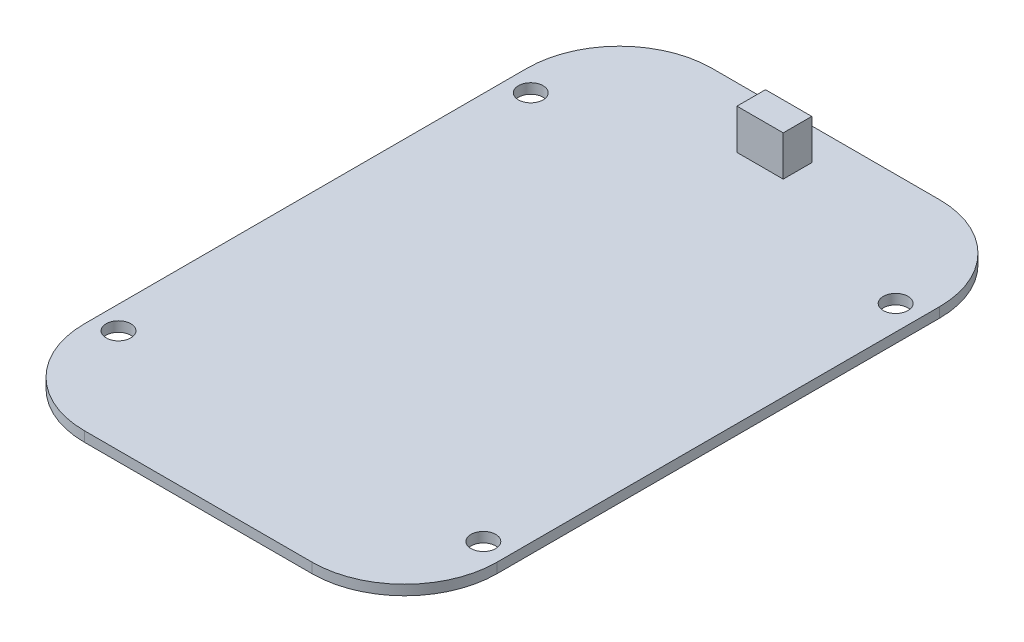
ISO-10303-21;
HEADER;
FILE_DESCRIPTION(('STEP AP214'),'2;1');
FILE_NAME('part.step','',(''),(''),'','','');
FILE_SCHEMA(('AUTOMOTIVE_DESIGN { 1 0 10303 214 1 1 1 1 }'));
ENDSEC;
DATA;
#1=APPLICATION_CONTEXT('core data for automotive mechanical design processes');
#2=APPLICATION_PROTOCOL_DEFINITION('international standard','automotive_design',2000,#1);
#3=PRODUCT_CONTEXT('',#1,'mechanical');
#4=PRODUCT('Part','Part','',(#3));
#5=PRODUCT_RELATED_PRODUCT_CATEGORY('part','',(#4));
#6=PRODUCT_DEFINITION_FORMATION('','',#4);
#7=PRODUCT_DEFINITION_CONTEXT('part definition',#1,'design');
#8=PRODUCT_DEFINITION('design','',#6,#7);
#9=PRODUCT_DEFINITION_SHAPE('','',#8);
#10=(LENGTH_UNIT() NAMED_UNIT(*) SI_UNIT(.MILLI.,.METRE.));
#11=(NAMED_UNIT(*) PLANE_ANGLE_UNIT() SI_UNIT($,.RADIAN.));
#12=(NAMED_UNIT(*) SI_UNIT($,.STERADIAN.) SOLID_ANGLE_UNIT());
#13=UNCERTAINTY_MEASURE_WITH_UNIT(LENGTH_MEASURE(1.E-05),#10,'distance_accuracy_value','');
#14=(GEOMETRIC_REPRESENTATION_CONTEXT(3) GLOBAL_UNCERTAINTY_ASSIGNED_CONTEXT((#13)) GLOBAL_UNIT_ASSIGNED_CONTEXT((#10,
#11,#12)) REPRESENTATION_CONTEXT('',''));
#15=CARTESIAN_POINT('',(0.,0.,0.));
#16=DIRECTION('',(0.,0.,1.));
#17=DIRECTION('',(1.,0.,0.));
#18=AXIS2_PLACEMENT_3D('',#15,#16,#17);
#19=CARTESIAN_POINT('',(-20.8015755341852,1.3,35.6254963779364));
#20=DIRECTION('',(0.,1.,0.));
#21=DIRECTION('',(0.,0.,1.));
#22=AXIS2_PLACEMENT_3D('',#19,#20,#21);
#23=PLANE('',#22);
#24=CARTESIAN_POINT('',(-20.8015755341852,1.3,35.6254963779364));
#25=DIRECTION('',(0.,1.,0.));
#26=DIRECTION('',(0.,0.,1.));
#27=AXIS2_PLACEMENT_3D('',#24,#25,#26);
#28=CIRCLE('',#27,12.);
#29=CARTESIAN_POINT('',(-32.8015755341852,1.3,35.6254963779363));
#30=VERTEX_POINT('',#29);
#31=CARTESIAN_POINT('',(-20.8015755341851,1.3,47.6254963779364));
#32=VERTEX_POINT('',#31);
#33=EDGE_CURVE('E158',#30,#32,#28,.T.);
#34=ORIENTED_EDGE('',*,*,#33,.T.);
#35=DIRECTION('',(1.,0.,0.));
#36=VECTOR('',#35,1.);
#37=CARTESIAN_POINT('',(-20.8015755341851,1.3,47.6254963779364));
#38=LINE('',#37,#36);
#39=CARTESIAN_POINT('',(8.72842446581473,1.3,47.6254963779364));
#40=VERTEX_POINT('',#39);
#41=EDGE_CURVE('E98',#32,#40,#38,.T.);
#42=ORIENTED_EDGE('',*,*,#41,.T.);
#43=CARTESIAN_POINT('',(8.72842446581481,1.3,35.6254963779364));
#44=DIRECTION('',(0.,1.,0.));
#45=DIRECTION('',(0.,0.,1.));
#46=AXIS2_PLACEMENT_3D('',#43,#44,#45);
#47=CIRCLE('',#46,12.);
#48=CARTESIAN_POINT('',(20.7284244658148,1.3,35.6254963779363));
#49=VERTEX_POINT('',#48);
#50=EDGE_CURVE('E173',#40,#49,#47,.T.);
#51=ORIENTED_EDGE('',*,*,#50,.T.);
#52=DIRECTION('',(0.,0.,-1.));
#53=VECTOR('',#52,1.);
#54=CARTESIAN_POINT('',(20.7284244658148,1.3,-21.7745036220635));
#55=LINE('',#54,#53);
#56=CARTESIAN_POINT('',(20.7284244658148,1.3,-21.7745036220635));
#57=VERTEX_POINT('',#56);
#58=EDGE_CURVE('E185',#49,#57,#55,.T.);
#59=ORIENTED_EDGE('',*,*,#58,.T.);
#60=CARTESIAN_POINT('',(8.72842446581481,1.3,-21.7745036220636));
#61=DIRECTION('',(0.,1.,0.));
#62=DIRECTION('',(0.,0.,1.));
#63=AXIS2_PLACEMENT_3D('',#60,#61,#62);
#64=CIRCLE('',#63,12.);
#65=CARTESIAN_POINT('',(8.72842446581472,1.3,-33.7745036220636));
#66=VERTEX_POINT('',#65);
#67=EDGE_CURVE('E121',#57,#66,#64,.T.);
#68=ORIENTED_EDGE('',*,*,#67,.T.);
#69=DIRECTION('',(-1.,0.,0.));
#70=VECTOR('',#69,1.);
#71=CARTESIAN_POINT('',(-20.8015755341851,1.3,-33.7745036220636));
#72=LINE('',#71,#70);
#73=CARTESIAN_POINT('',(-20.8015755341851,1.3,-33.7745036220636));
#74=VERTEX_POINT('',#73);
#75=EDGE_CURVE('E114',#66,#74,#72,.T.);
#76=ORIENTED_EDGE('',*,*,#75,.T.);
#77=CARTESIAN_POINT('',(-20.8015755341852,1.3,-21.7745036220636));
#78=DIRECTION('',(0.,1.,0.));
#79=DIRECTION('',(0.,0.,-1.));
#80=AXIS2_PLACEMENT_3D('',#77,#78,#79);
#81=CIRCLE('',#80,12.);
#82=CARTESIAN_POINT('',(-32.8015755341852,1.3,-21.7745036220635));
#83=VERTEX_POINT('',#82);
#84=EDGE_CURVE('E118',#74,#83,#81,.T.);
#85=ORIENTED_EDGE('',*,*,#84,.T.);
#86=DIRECTION('',(0.,0.,1.));
#87=VECTOR('',#86,1.);
#88=CARTESIAN_POINT('',(-32.8015755341852,1.3,-21.7745036220635));
#89=LINE('',#88,#87);
#90=EDGE_CURVE('E57',#83,#30,#89,.T.);
#91=ORIENTED_EDGE('',*,*,#90,.T.);
#92=EDGE_LOOP('',(#34,#42,#51,#59,#68,#76,#85,#91));
#93=FACE_BOUND('',#92,.T.);
#94=CARTESIAN_POINT('',(-29.8015755341852,1.3,-19.2745036220636));
#95=DIRECTION('',(0.,1.,0.));
#96=DIRECTION('',(0.,0.,1.));
#97=AXIS2_PLACEMENT_3D('',#94,#95,#96);
#98=CIRCLE('',#97,1.6);
#99=CARTESIAN_POINT('',(-29.8015755341852,1.3,-17.6745036220636));
#100=VERTEX_POINT('',#99);
#101=EDGE_CURVE('E191',#100,#100,#98,.T.);
#102=ORIENTED_EDGE('',*,*,#101,.F.);
#103=EDGE_LOOP('',(#102));
#104=FACE_BOUND('',#103,.T.);
#105=CARTESIAN_POINT('',(17.5184244658148,1.3,-19.2745036220636));
#106=DIRECTION('',(0.,1.,0.));
#107=DIRECTION('',(0.,0.,1.));
#108=AXIS2_PLACEMENT_3D('',#105,#106,#107);
#109=CIRCLE('',#108,1.6);
#110=CARTESIAN_POINT('',(17.5184244658148,1.3,-17.6745036220636));
#111=VERTEX_POINT('',#110);
#112=EDGE_CURVE('E197',#111,#111,#109,.T.);
#113=ORIENTED_EDGE('',*,*,#112,.F.);
#114=EDGE_LOOP('',(#113));
#115=FACE_BOUND('',#114,.T.);
#116=CARTESIAN_POINT('',(17.5184244658154,1.3,34.1954963779364));
#117=DIRECTION('',(0.,1.,0.));
#118=DIRECTION('',(0.,0.,1.));
#119=AXIS2_PLACEMENT_3D('',#116,#117,#118);
#120=CIRCLE('',#119,1.6);
#121=CARTESIAN_POINT('',(17.5184244658154,1.3,35.7954963779364));
#122=VERTEX_POINT('',#121);
#123=EDGE_CURVE('E203',#122,#122,#120,.T.);
#124=ORIENTED_EDGE('',*,*,#123,.F.);
#125=EDGE_LOOP('',(#124));
#126=FACE_BOUND('',#125,.T.);
#127=CARTESIAN_POINT('',(-29.8015755341846,1.3,34.1954963779364));
#128=DIRECTION('',(0.,1.,0.));
#129=DIRECTION('',(0.,0.,1.));
#130=AXIS2_PLACEMENT_3D('',#127,#128,#129);
#131=CIRCLE('',#130,1.6);
#132=CARTESIAN_POINT('',(-29.8015755341846,1.3,35.7954963779364));
#133=VERTEX_POINT('',#132);
#134=EDGE_CURVE('E209',#133,#133,#131,.T.);
#135=ORIENTED_EDGE('',*,*,#134,.F.);
#136=EDGE_LOOP('',(#135));
#137=FACE_BOUND('',#136,.T.);
#138=DIRECTION('',(1.,0.,0.));
#139=VECTOR('',#138,1.);
#140=CARTESIAN_POINT('',(-9.7315755341852,1.3,-25.9445036220636));
#141=LINE('',#140,#139);
#142=CARTESIAN_POINT('',(-9.7315755341852,1.3,-25.9445036220636));
#143=VERTEX_POINT('',#142);
#144=CARTESIAN_POINT('',(-3.7315755341852,1.3,-25.9445036220636));
#145=VERTEX_POINT('',#144);
#146=EDGE_CURVE('E230',#143,#145,#141,.T.);
#147=ORIENTED_EDGE('',*,*,#146,.F.);
#148=DIRECTION('',(0.,0.,1.));
#149=VECTOR('',#148,1.);
#150=CARTESIAN_POINT('',(-9.7315755341852,1.3,-29.6445036220636));
#151=LINE('',#150,#149);
#152=CARTESIAN_POINT('',(-9.7315755341852,1.3,-29.6445036220636));
#153=VERTEX_POINT('',#152);
#154=EDGE_CURVE('E233',#153,#143,#151,.T.);
#155=ORIENTED_EDGE('',*,*,#154,.F.);
#156=DIRECTION('',(-1.,0.,0.));
#157=VECTOR('',#156,1.);
#158=CARTESIAN_POINT('',(-9.7315755341852,1.3,-29.6445036220636));
#159=LINE('',#158,#157);
#160=CARTESIAN_POINT('',(-3.7315755341852,1.3,-29.6445036220636));
#161=VERTEX_POINT('',#160);
#162=EDGE_CURVE('E225',#161,#153,#159,.T.);
#163=ORIENTED_EDGE('',*,*,#162,.F.);
#164=DIRECTION('',(0.,0.,-1.));
#165=VECTOR('',#164,1.);
#166=CARTESIAN_POINT('',(-3.7315755341852,1.3,-29.6445036220636));
#167=LINE('',#166,#165);
#168=EDGE_CURVE('E228',#145,#161,#167,.T.);
#169=ORIENTED_EDGE('',*,*,#168,.F.);
#170=EDGE_LOOP('',(#147,#155,#163,#169));
#171=FACE_BOUND('',#170,.T.);
#172=ADVANCED_FACE('F33',(#93,#104,#115,#126,#137,#171),#23,.T.);
#173=CARTESIAN_POINT('',(-20.8015755341852,1.3,35.6254963779364));
#174=DIRECTION('',(0.,-1.,0.));
#175=DIRECTION('',(0.,0.,-1.));
#176=AXIS2_PLACEMENT_3D('',#173,#174,#175);
#177=CYLINDRICAL_SURFACE('',#176,12.);
#178=CARTESIAN_POINT('',(-20.8015755341852,0.,35.6254963779364));
#179=DIRECTION('',(0.,1.,0.));
#180=DIRECTION('',(0.,0.,1.));
#181=AXIS2_PLACEMENT_3D('',#178,#179,#180);
#182=CIRCLE('',#181,12.);
#183=CARTESIAN_POINT('',(-32.8015755341852,0.,35.6254963779363));
#184=VERTEX_POINT('',#183);
#185=CARTESIAN_POINT('',(-20.8015755341851,0.,47.6254963779364));
#186=VERTEX_POINT('',#185);
#187=EDGE_CURVE('E142',#184,#186,#182,.T.);
#188=ORIENTED_EDGE('',*,*,#187,.T.);
#189=DIRECTION('',(0.,-1.,0.));
#190=VECTOR('',#189,1.);
#191=CARTESIAN_POINT('',(-20.8015755341851,1.3,47.6254963779364));
#192=LINE('',#191,#190);
#193=EDGE_CURVE('E11',#32,#186,#192,.T.);
#194=ORIENTED_EDGE('',*,*,#193,.F.);
#195=ORIENTED_EDGE('',*,*,#33,.F.);
#196=DIRECTION('',(0.,-1.,0.));
#197=VECTOR('',#196,1.);
#198=CARTESIAN_POINT('',(-32.8015755341852,1.3,35.6254963779363));
#199=LINE('',#198,#197);
#200=EDGE_CURVE('E138',#30,#184,#199,.T.);
#201=ORIENTED_EDGE('',*,*,#200,.T.);
#202=EDGE_LOOP('',(#188,#194,#195,#201));
#203=FACE_BOUND('',#202,.T.);
#204=ADVANCED_FACE('F35',(#203),#177,.T.);
#205=CARTESIAN_POINT('',(-20.8015755341851,1.3,47.6254963779364));
#206=DIRECTION('',(0.,0.,-1.));
#207=DIRECTION('',(-1.,0.,0.));
#208=AXIS2_PLACEMENT_3D('',#205,#206,#207);
#209=PLANE('',#208);
#210=DIRECTION('',(1.,0.,0.));
#211=VECTOR('',#210,1.);
#212=CARTESIAN_POINT('',(-20.8015755341851,0.,47.6254963779364));
#213=LINE('',#212,#211);
#214=CARTESIAN_POINT('',(8.72842446581473,0.,47.6254963779364));
#215=VERTEX_POINT('',#214);
#216=EDGE_CURVE('E145',#186,#215,#213,.T.);
#217=ORIENTED_EDGE('',*,*,#216,.T.);
#218=DIRECTION('',(0.,-1.,0.));
#219=VECTOR('',#218,1.);
#220=CARTESIAN_POINT('',(8.72842446581473,1.3,47.6254963779364));
#221=LINE('',#220,#219);
#222=EDGE_CURVE('E41',#40,#215,#221,.T.);
#223=ORIENTED_EDGE('',*,*,#222,.F.);
#224=ORIENTED_EDGE('',*,*,#41,.F.);
#225=ORIENTED_EDGE('',*,*,#193,.T.);
#226=EDGE_LOOP('',(#217,#223,#224,#225));
#227=FACE_BOUND('',#226,.T.);
#228=ADVANCED_FACE('F280',(#227),#209,.F.);
#229=CARTESIAN_POINT('',(8.72842446581481,1.3,35.6254963779364));
#230=DIRECTION('',(0.,-1.,0.));
#231=DIRECTION('',(0.,0.,-1.));
#232=AXIS2_PLACEMENT_3D('',#229,#230,#231);
#233=CYLINDRICAL_SURFACE('',#232,12.);
#234=CARTESIAN_POINT('',(8.72842446581481,0.,35.6254963779364));
#235=DIRECTION('',(0.,1.,0.));
#236=DIRECTION('',(0.,0.,1.));
#237=AXIS2_PLACEMENT_3D('',#234,#235,#236);
#238=CIRCLE('',#237,12.);
#239=CARTESIAN_POINT('',(20.7284244658148,0.,35.6254963779363));
#240=VERTEX_POINT('',#239);
#241=EDGE_CURVE('E148',#215,#240,#238,.T.);
#242=ORIENTED_EDGE('',*,*,#241,.T.);
#243=DIRECTION('',(0.,-1.,0.));
#244=VECTOR('',#243,1.);
#245=CARTESIAN_POINT('',(20.7284244658148,1.3,35.6254963779363));
#246=LINE('',#245,#244);
#247=EDGE_CURVE('E165',#49,#240,#246,.T.);
#248=ORIENTED_EDGE('',*,*,#247,.F.);
#249=ORIENTED_EDGE('',*,*,#50,.F.);
#250=ORIENTED_EDGE('',*,*,#222,.T.);
#251=EDGE_LOOP('',(#242,#248,#249,#250));
#252=FACE_BOUND('',#251,.T.);
#253=ADVANCED_FACE('F171',(#252),#233,.T.);
#254=CARTESIAN_POINT('',(20.7284244658148,1.3,-21.7745036220635));
#255=DIRECTION('',(-1.,0.,0.));
#256=DIRECTION('',(0.,0.,1.));
#257=AXIS2_PLACEMENT_3D('',#254,#255,#256);
#258=PLANE('',#257);
#259=DIRECTION('',(0.,0.,-1.));
#260=VECTOR('',#259,1.);
#261=CARTESIAN_POINT('',(20.7284244658148,0.,-21.7745036220635));
#262=LINE('',#261,#260);
#263=CARTESIAN_POINT('',(20.7284244658148,0.,-21.7745036220635));
#264=VERTEX_POINT('',#263);
#265=EDGE_CURVE('E150',#240,#264,#262,.T.);
#266=ORIENTED_EDGE('',*,*,#265,.T.);
#267=DIRECTION('',(0.,-1.,0.));
#268=VECTOR('',#267,1.);
#269=CARTESIAN_POINT('',(20.7284244658148,1.3,-21.7745036220635));
#270=LINE('',#269,#268);
#271=EDGE_CURVE('E162',#57,#264,#270,.T.);
#272=ORIENTED_EDGE('',*,*,#271,.F.);
#273=ORIENTED_EDGE('',*,*,#58,.F.);
#274=ORIENTED_EDGE('',*,*,#247,.T.);
#275=EDGE_LOOP('',(#266,#272,#273,#274));
#276=FACE_BOUND('',#275,.T.);
#277=ADVANCED_FACE('F181',(#276),#258,.F.);
#278=CARTESIAN_POINT('',(8.72842446581481,1.3,-21.7745036220636));
#279=DIRECTION('',(0.,-1.,0.));
#280=DIRECTION('',(0.,0.,-1.));
#281=AXIS2_PLACEMENT_3D('',#278,#279,#280);
#282=CYLINDRICAL_SURFACE('',#281,12.);
#283=CARTESIAN_POINT('',(8.72842446581481,0.,-21.7745036220636));
#284=DIRECTION('',(0.,1.,0.));
#285=DIRECTION('',(0.,0.,1.));
#286=AXIS2_PLACEMENT_3D('',#283,#284,#285);
#287=CIRCLE('',#286,12.);
#288=CARTESIAN_POINT('',(8.72842446581472,0.,-33.7745036220636));
#289=VERTEX_POINT('',#288);
#290=EDGE_CURVE('E152',#264,#289,#287,.T.);
#291=ORIENTED_EDGE('',*,*,#290,.T.);
#292=DIRECTION('',(0.,-1.,0.));
#293=VECTOR('',#292,1.);
#294=CARTESIAN_POINT('',(8.72842446581472,1.3,-33.7745036220636));
#295=LINE('',#294,#293);
#296=EDGE_CURVE('E133',#66,#289,#295,.T.);
#297=ORIENTED_EDGE('',*,*,#296,.F.);
#298=ORIENTED_EDGE('',*,*,#67,.F.);
#299=ORIENTED_EDGE('',*,*,#271,.T.);
#300=EDGE_LOOP('',(#291,#297,#298,#299));
#301=FACE_BOUND('',#300,.T.);
#302=ADVANCED_FACE('F184',(#301),#282,.T.);
#303=CARTESIAN_POINT('',(-20.8015755341851,1.3,-33.7745036220636));
#304=DIRECTION('',(0.,0.,1.));
#305=DIRECTION('',(1.,0.,0.));
#306=AXIS2_PLACEMENT_3D('',#303,#304,#305);
#307=PLANE('',#306);
#308=DIRECTION('',(-1.,0.,0.));
#309=VECTOR('',#308,1.);
#310=CARTESIAN_POINT('',(-20.8015755341851,0.,-33.7745036220636));
#311=LINE('',#310,#309);
#312=CARTESIAN_POINT('',(-20.8015755341851,0.,-33.7745036220636));
#313=VERTEX_POINT('',#312);
#314=EDGE_CURVE('E130',#289,#313,#311,.T.);
#315=ORIENTED_EDGE('',*,*,#314,.T.);
#316=DIRECTION('',(0.,-1.,0.));
#317=VECTOR('',#316,1.);
#318=CARTESIAN_POINT('',(-20.8015755341851,1.3,-33.7745036220636));
#319=LINE('',#318,#317);
#320=EDGE_CURVE('E127',#74,#313,#319,.T.);
#321=ORIENTED_EDGE('',*,*,#320,.F.);
#322=ORIENTED_EDGE('',*,*,#75,.F.);
#323=ORIENTED_EDGE('',*,*,#296,.T.);
#324=EDGE_LOOP('',(#315,#321,#322,#323));
#325=FACE_BOUND('',#324,.T.);
#326=ADVANCED_FACE('F128',(#325),#307,.F.);
#327=CARTESIAN_POINT('',(-20.8015755341852,1.3,-21.7745036220636));
#328=DIRECTION('',(0.,-1.,0.));
#329=DIRECTION('',(0.,0.,-1.));
#330=AXIS2_PLACEMENT_3D('',#327,#328,#329);
#331=CYLINDRICAL_SURFACE('',#330,12.);
#332=CARTESIAN_POINT('',(-20.8015755341852,0.,-21.7745036220636));
#333=DIRECTION('',(0.,1.,0.));
#334=DIRECTION('',(0.,0.,-1.));
#335=AXIS2_PLACEMENT_3D('',#332,#333,#334);
#336=CIRCLE('',#335,12.);
#337=CARTESIAN_POINT('',(-32.8015755341852,0.,-21.7745036220635));
#338=VERTEX_POINT('',#337);
#339=EDGE_CURVE('E155',#313,#338,#336,.T.);
#340=ORIENTED_EDGE('',*,*,#339,.T.);
#341=DIRECTION('',(0.,-1.,0.));
#342=VECTOR('',#341,1.);
#343=CARTESIAN_POINT('',(-32.8015755341852,1.3,-21.7745036220635));
#344=LINE('',#343,#342);
#345=EDGE_CURVE('E134',#83,#338,#344,.T.);
#346=ORIENTED_EDGE('',*,*,#345,.F.);
#347=ORIENTED_EDGE('',*,*,#84,.F.);
#348=ORIENTED_EDGE('',*,*,#320,.T.);
#349=EDGE_LOOP('',(#340,#346,#347,#348));
#350=FACE_BOUND('',#349,.T.);
#351=ADVANCED_FACE('F136',(#350),#331,.T.);
#352=CARTESIAN_POINT('',(-32.8015755341852,1.3,-21.7745036220635));
#353=DIRECTION('',(1.,0.,0.));
#354=DIRECTION('',(0.,0.,-1.));
#355=AXIS2_PLACEMENT_3D('',#352,#353,#354);
#356=PLANE('',#355);
#357=DIRECTION('',(0.,0.,1.));
#358=VECTOR('',#357,1.);
#359=CARTESIAN_POINT('',(-32.8015755341852,0.,-21.7745036220635));
#360=LINE('',#359,#358);
#361=EDGE_CURVE('E90',#338,#184,#360,.T.);
#362=ORIENTED_EDGE('',*,*,#361,.T.);
#363=ORIENTED_EDGE('',*,*,#200,.F.);
#364=ORIENTED_EDGE('',*,*,#90,.F.);
#365=ORIENTED_EDGE('',*,*,#345,.T.);
#366=EDGE_LOOP('',(#362,#363,#364,#365));
#367=FACE_BOUND('',#366,.T.);
#368=ADVANCED_FACE('F288',(#367),#356,.F.);
#369=CARTESIAN_POINT('',(-20.8015755341852,0.,35.6254963779364));
#370=DIRECTION('',(0.,1.,0.));
#371=DIRECTION('',(0.,0.,1.));
#372=AXIS2_PLACEMENT_3D('',#369,#370,#371);
#373=PLANE('',#372);
#374=CARTESIAN_POINT('',(-29.8015755341846,0.,34.1954963779364));
#375=DIRECTION('',(0.,1.,0.));
#376=DIRECTION('',(0.,0.,1.));
#377=AXIS2_PLACEMENT_3D('',#374,#375,#376);
#378=CIRCLE('',#377,1.6);
#379=CARTESIAN_POINT('',(-29.8015755341846,0.,35.7954963779364));
#380=VERTEX_POINT('',#379);
#381=EDGE_CURVE('E206',#380,#380,#378,.T.);
#382=ORIENTED_EDGE('',*,*,#381,.T.);
#383=EDGE_LOOP('',(#382));
#384=FACE_BOUND('',#383,.T.);
#385=CARTESIAN_POINT('',(17.5184244658154,0.,34.1954963779364));
#386=DIRECTION('',(0.,1.,0.));
#387=DIRECTION('',(0.,0.,1.));
#388=AXIS2_PLACEMENT_3D('',#385,#386,#387);
#389=CIRCLE('',#388,1.6);
#390=CARTESIAN_POINT('',(17.5184244658154,0.,35.7954963779364));
#391=VERTEX_POINT('',#390);
#392=EDGE_CURVE('E200',#391,#391,#389,.T.);
#393=ORIENTED_EDGE('',*,*,#392,.T.);
#394=EDGE_LOOP('',(#393));
#395=FACE_BOUND('',#394,.T.);
#396=CARTESIAN_POINT('',(17.5184244658148,0.,-19.2745036220636));
#397=DIRECTION('',(0.,1.,0.));
#398=DIRECTION('',(0.,0.,1.));
#399=AXIS2_PLACEMENT_3D('',#396,#397,#398);
#400=CIRCLE('',#399,1.6);
#401=CARTESIAN_POINT('',(17.5184244658148,0.,-17.6745036220636));
#402=VERTEX_POINT('',#401);
#403=EDGE_CURVE('E194',#402,#402,#400,.T.);
#404=ORIENTED_EDGE('',*,*,#403,.T.);
#405=EDGE_LOOP('',(#404));
#406=FACE_BOUND('',#405,.T.);
#407=CARTESIAN_POINT('',(-29.8015755341852,0.,-19.2745036220636));
#408=DIRECTION('',(0.,1.,0.));
#409=DIRECTION('',(0.,0.,1.));
#410=AXIS2_PLACEMENT_3D('',#407,#408,#409);
#411=CIRCLE('',#410,1.6);
#412=CARTESIAN_POINT('',(-29.8015755341852,0.,-17.6745036220636));
#413=VERTEX_POINT('',#412);
#414=EDGE_CURVE('E146',#413,#413,#411,.T.);
#415=ORIENTED_EDGE('',*,*,#414,.T.);
#416=EDGE_LOOP('',(#415));
#417=FACE_BOUND('',#416,.T.);
#418=ORIENTED_EDGE('',*,*,#187,.F.);
#419=ORIENTED_EDGE('',*,*,#361,.F.);
#420=ORIENTED_EDGE('',*,*,#339,.F.);
#421=ORIENTED_EDGE('',*,*,#314,.F.);
#422=ORIENTED_EDGE('',*,*,#290,.F.);
#423=ORIENTED_EDGE('',*,*,#265,.F.);
#424=ORIENTED_EDGE('',*,*,#241,.F.);
#425=ORIENTED_EDGE('',*,*,#216,.F.);
#426=EDGE_LOOP('',(#418,#419,#420,#421,#422,#423,#424,#425));
#427=FACE_BOUND('',#426,.T.);
#428=ADVANCED_FACE('F177',(#384,#395,#406,#417,#427),#373,.F.);
#429=CARTESIAN_POINT('',(-29.8015755341852,0.,-19.2745036220636));
#430=DIRECTION('',(0.,1.,0.));
#431=DIRECTION('',(0.,0.,1.));
#432=AXIS2_PLACEMENT_3D('',#429,#430,#431);
#433=CYLINDRICAL_SURFACE('',#432,1.6);
#434=ORIENTED_EDGE('',*,*,#414,.F.);
#435=EDGE_LOOP('',(#434));
#436=FACE_BOUND('',#435,.T.);
#437=ORIENTED_EDGE('',*,*,#101,.T.);
#438=EDGE_LOOP('',(#437));
#439=FACE_BOUND('',#438,.T.);
#440=ADVANCED_FACE('F284',(#436,#439),#433,.F.);
#441=CARTESIAN_POINT('',(17.5184244658148,0.,-19.2745036220636));
#442=DIRECTION('',(0.,1.,0.));
#443=DIRECTION('',(0.,0.,1.));
#444=AXIS2_PLACEMENT_3D('',#441,#442,#443);
#445=CYLINDRICAL_SURFACE('',#444,1.6);
#446=ORIENTED_EDGE('',*,*,#403,.F.);
#447=EDGE_LOOP('',(#446));
#448=FACE_BOUND('',#447,.T.);
#449=ORIENTED_EDGE('',*,*,#112,.T.);
#450=EDGE_LOOP('',(#449));
#451=FACE_BOUND('',#450,.T.);
#452=ADVANCED_FACE('F342',(#448,#451),#445,.F.);
#453=CARTESIAN_POINT('',(17.5184244658154,0.,34.1954963779364));
#454=DIRECTION('',(0.,1.,0.));
#455=DIRECTION('',(0.,0.,1.));
#456=AXIS2_PLACEMENT_3D('',#453,#454,#455);
#457=CYLINDRICAL_SURFACE('',#456,1.6);
#458=ORIENTED_EDGE('',*,*,#392,.F.);
#459=EDGE_LOOP('',(#458));
#460=FACE_BOUND('',#459,.T.);
#461=ORIENTED_EDGE('',*,*,#123,.T.);
#462=EDGE_LOOP('',(#461));
#463=FACE_BOUND('',#462,.T.);
#464=ADVANCED_FACE('F349',(#460,#463),#457,.F.);
#465=CARTESIAN_POINT('',(-29.8015755341846,0.,34.1954963779364));
#466=DIRECTION('',(0.,1.,0.));
#467=DIRECTION('',(0.,0.,1.));
#468=AXIS2_PLACEMENT_3D('',#465,#466,#467);
#469=CYLINDRICAL_SURFACE('',#468,1.6);
#470=ORIENTED_EDGE('',*,*,#381,.F.);
#471=EDGE_LOOP('',(#470));
#472=FACE_BOUND('',#471,.T.);
#473=ORIENTED_EDGE('',*,*,#134,.T.);
#474=EDGE_LOOP('',(#473));
#475=FACE_BOUND('',#474,.T.);
#476=ADVANCED_FACE('F356',(#472,#475),#469,.F.);
#477=CARTESIAN_POINT('',(-9.7315755341852,6.5,-29.6445036220636));
#478=DIRECTION('',(1.,0.,0.));
#479=DIRECTION('',(0.,0.,-1.));
#480=AXIS2_PLACEMENT_3D('',#477,#478,#479);
#481=PLANE('',#480);
#482=ORIENTED_EDGE('',*,*,#154,.T.);
#483=DIRECTION('',(0.,-1.,0.));
#484=VECTOR('',#483,1.);
#485=CARTESIAN_POINT('',(-9.7315755341852,6.5,-25.9445036220636));
#486=LINE('',#485,#484);
#487=CARTESIAN_POINT('',(-9.7315755341852,6.5,-25.9445036220636));
#488=VERTEX_POINT('',#487);
#489=EDGE_CURVE('E212',#488,#143,#486,.T.);
#490=ORIENTED_EDGE('',*,*,#489,.F.);
#491=DIRECTION('',(0.,0.,1.));
#492=VECTOR('',#491,1.);
#493=CARTESIAN_POINT('',(-9.7315755341852,6.5,-29.6445036220636));
#494=LINE('',#493,#492);
#495=CARTESIAN_POINT('',(-9.7315755341852,6.5,-29.6445036220636));
#496=VERTEX_POINT('',#495);
#497=EDGE_CURVE('E227',#496,#488,#494,.T.);
#498=ORIENTED_EDGE('',*,*,#497,.F.);
#499=DIRECTION('',(0.,-1.,0.));
#500=VECTOR('',#499,1.);
#501=CARTESIAN_POINT('',(-9.7315755341852,6.5,-29.6445036220636));
#502=LINE('',#501,#500);
#503=EDGE_CURVE('E221',#496,#153,#502,.T.);
#504=ORIENTED_EDGE('',*,*,#503,.T.);
#505=EDGE_LOOP('',(#482,#490,#498,#504));
#506=FACE_BOUND('',#505,.T.);
#507=ADVANCED_FACE('F256',(#506),#481,.F.);
#508=CARTESIAN_POINT('',(-9.7315755341852,6.5,-25.9445036220636));
#509=DIRECTION('',(0.,0.,-1.));
#510=DIRECTION('',(-1.,0.,0.));
#511=AXIS2_PLACEMENT_3D('',#508,#509,#510);
#512=PLANE('',#511);
#513=ORIENTED_EDGE('',*,*,#146,.T.);
#514=DIRECTION('',(0.,-1.,0.));
#515=VECTOR('',#514,1.);
#516=CARTESIAN_POINT('',(-3.7315755341852,6.5,-25.9445036220636));
#517=LINE('',#516,#515);
#518=CARTESIAN_POINT('',(-3.7315755341852,6.5,-25.9445036220636));
#519=VERTEX_POINT('',#518);
#520=EDGE_CURVE('E217',#519,#145,#517,.T.);
#521=ORIENTED_EDGE('',*,*,#520,.F.);
#522=DIRECTION('',(1.,0.,0.));
#523=VECTOR('',#522,1.);
#524=CARTESIAN_POINT('',(-9.7315755341852,6.5,-25.9445036220636));
#525=LINE('',#524,#523);
#526=EDGE_CURVE('E241',#488,#519,#525,.T.);
#527=ORIENTED_EDGE('',*,*,#526,.F.);
#528=ORIENTED_EDGE('',*,*,#489,.T.);
#529=EDGE_LOOP('',(#513,#521,#527,#528));
#530=FACE_BOUND('',#529,.T.);
#531=ADVANCED_FACE('F261',(#530),#512,.F.);
#532=CARTESIAN_POINT('',(-3.7315755341852,6.5,-29.6445036220636));
#533=DIRECTION('',(-1.,0.,0.));
#534=DIRECTION('',(0.,0.,1.));
#535=AXIS2_PLACEMENT_3D('',#532,#533,#534);
#536=PLANE('',#535);
#537=ORIENTED_EDGE('',*,*,#168,.T.);
#538=DIRECTION('',(0.,-1.,0.));
#539=VECTOR('',#538,1.);
#540=CARTESIAN_POINT('',(-3.7315755341852,6.5,-29.6445036220636));
#541=LINE('',#540,#539);
#542=CARTESIAN_POINT('',(-3.7315755341852,6.5,-29.6445036220636));
#543=VERTEX_POINT('',#542);
#544=EDGE_CURVE('E48',#543,#161,#541,.T.);
#545=ORIENTED_EDGE('',*,*,#544,.F.);
#546=DIRECTION('',(0.,0.,-1.));
#547=VECTOR('',#546,1.);
#548=CARTESIAN_POINT('',(-3.7315755341852,6.5,-29.6445036220636));
#549=LINE('',#548,#547);
#550=EDGE_CURVE('E238',#519,#543,#549,.T.);
#551=ORIENTED_EDGE('',*,*,#550,.F.);
#552=ORIENTED_EDGE('',*,*,#520,.T.);
#553=EDGE_LOOP('',(#537,#545,#551,#552));
#554=FACE_BOUND('',#553,.T.);
#555=ADVANCED_FACE('F270',(#554),#536,.F.);
#556=CARTESIAN_POINT('',(-9.7315755341852,6.5,-29.6445036220636));
#557=DIRECTION('',(0.,0.,1.));
#558=DIRECTION('',(1.,0.,0.));
#559=AXIS2_PLACEMENT_3D('',#556,#557,#558);
#560=PLANE('',#559);
#561=ORIENTED_EDGE('',*,*,#162,.T.);
#562=ORIENTED_EDGE('',*,*,#503,.F.);
#563=DIRECTION('',(-1.,0.,0.));
#564=VECTOR('',#563,1.);
#565=CARTESIAN_POINT('',(-9.7315755341852,6.5,-29.6445036220636));
#566=LINE('',#565,#564);
#567=EDGE_CURVE('E224',#543,#496,#566,.T.);
#568=ORIENTED_EDGE('',*,*,#567,.F.);
#569=ORIENTED_EDGE('',*,*,#544,.T.);
#570=EDGE_LOOP('',(#561,#562,#568,#569));
#571=FACE_BOUND('',#570,.T.);
#572=ADVANCED_FACE('F273',(#571),#560,.F.);
#573=CARTESIAN_POINT('',(0.,6.5,0.));
#574=DIRECTION('',(0.,1.,0.));
#575=DIRECTION('',(0.,0.,1.));
#576=AXIS2_PLACEMENT_3D('',#573,#574,#575);
#577=PLANE('',#576);
#578=ORIENTED_EDGE('',*,*,#497,.T.);
#579=ORIENTED_EDGE('',*,*,#526,.T.);
#580=ORIENTED_EDGE('',*,*,#550,.T.);
#581=ORIENTED_EDGE('',*,*,#567,.T.);
#582=EDGE_LOOP('',(#578,#579,#580,#581));
#583=FACE_BOUND('',#582,.T.);
#584=ADVANCED_FACE('F249',(#583),#577,.T.);
#585=CLOSED_SHELL('',(#172,#204,#228,#253,#277,#302,#326,#351,#368,#428,#440,#452,#464,#476,
#507,#531,#555,#572,#584));
#586=MANIFOLD_SOLID_BREP('B2',#585);
#587=ADVANCED_BREP_SHAPE_REPRESENTATION('',(#18,#586),#14);
#588=SHAPE_DEFINITION_REPRESENTATION(#9,#587);
ENDSEC;
END-ISO-10303-21;
